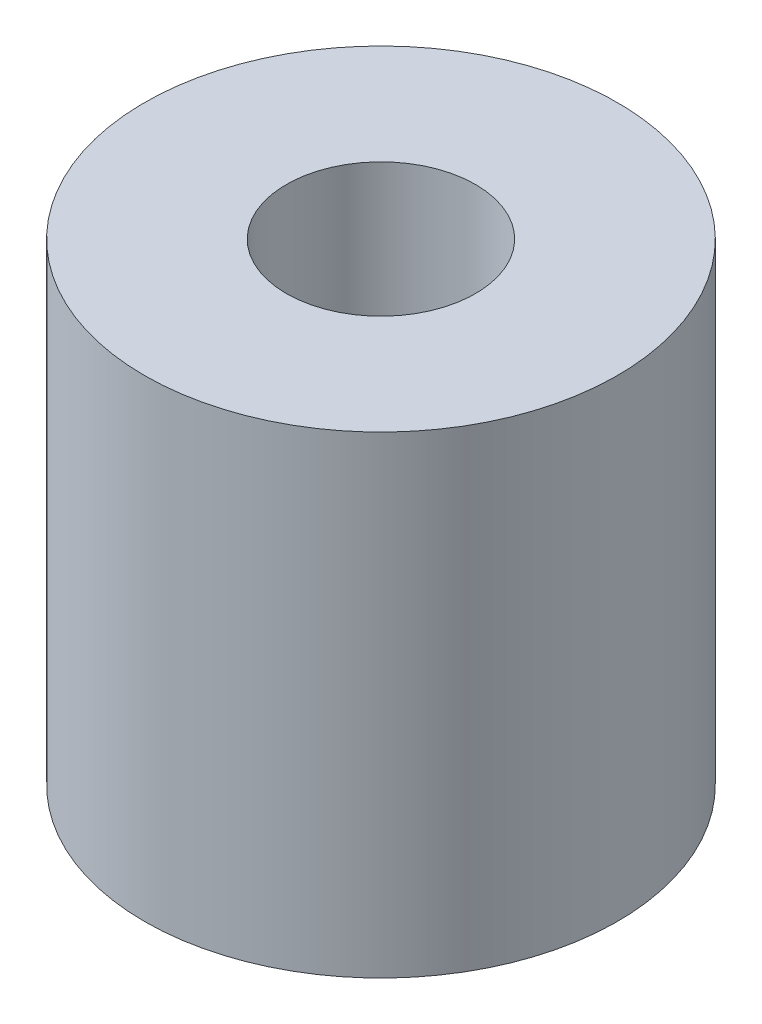
ISO-10303-21;
HEADER;
FILE_DESCRIPTION(('STEP AP214'),'2;1');
FILE_NAME('part.step','',(''),(''),'','','');
FILE_SCHEMA(('AUTOMOTIVE_DESIGN { 1 0 10303 214 1 1 1 1 }'));
ENDSEC;
DATA;
#1=APPLICATION_CONTEXT('core data for automotive mechanical design processes');
#2=APPLICATION_PROTOCOL_DEFINITION('international standard','automotive_design',2000,#1);
#3=PRODUCT_CONTEXT('',#1,'mechanical');
#4=PRODUCT('Part','Part','',(#3));
#5=PRODUCT_RELATED_PRODUCT_CATEGORY('part','',(#4));
#6=PRODUCT_DEFINITION_FORMATION('','',#4);
#7=PRODUCT_DEFINITION_CONTEXT('part definition',#1,'design');
#8=PRODUCT_DEFINITION('design','',#6,#7);
#9=PRODUCT_DEFINITION_SHAPE('','',#8);
#10=(LENGTH_UNIT() NAMED_UNIT(*) SI_UNIT(.MILLI.,.METRE.));
#11=(NAMED_UNIT(*) PLANE_ANGLE_UNIT() SI_UNIT($,.RADIAN.));
#12=(NAMED_UNIT(*) SI_UNIT($,.STERADIAN.) SOLID_ANGLE_UNIT());
#13=UNCERTAINTY_MEASURE_WITH_UNIT(LENGTH_MEASURE(1.E-05),#10,'distance_accuracy_value','');
#14=(GEOMETRIC_REPRESENTATION_CONTEXT(3) GLOBAL_UNCERTAINTY_ASSIGNED_CONTEXT((#13)) GLOBAL_UNIT_ASSIGNED_CONTEXT((#10,
#11,#12)) REPRESENTATION_CONTEXT('',''));
#15=CARTESIAN_POINT('',(0.,0.,0.));
#16=DIRECTION('',(0.,0.,1.));
#17=DIRECTION('',(1.,0.,0.));
#18=AXIS2_PLACEMENT_3D('',#15,#16,#17);
#19=CARTESIAN_POINT('',(0.,5.,0.));
#20=DIRECTION('',(0.,1.,0.));
#21=DIRECTION('',(0.,0.,1.));
#22=AXIS2_PLACEMENT_3D('',#19,#20,#21);
#23=PLANE('',#22);
#24=CARTESIAN_POINT('',(0.,5.,0.));
#25=DIRECTION('',(0.,1.,0.));
#26=DIRECTION('',(0.,0.,1.));
#27=AXIS2_PLACEMENT_3D('',#24,#25,#26);
#28=CIRCLE('',#27,2.5);
#29=CARTESIAN_POINT('',(0.,5.,2.5));
#30=VERTEX_POINT('',#29);
#31=EDGE_CURVE('E10',#30,#30,#28,.T.);
#32=ORIENTED_EDGE('',*,*,#31,.T.);
#33=EDGE_LOOP('',(#32));
#34=FACE_BOUND('',#33,.T.);
#35=CARTESIAN_POINT('',(0.,5.,0.));
#36=DIRECTION('',(0.,1.,0.));
#37=DIRECTION('',(0.,0.,1.));
#38=AXIS2_PLACEMENT_3D('',#35,#36,#37);
#39=CIRCLE('',#38,1.);
#40=CARTESIAN_POINT('',(0.,5.,1.));
#41=VERTEX_POINT('',#40);
#42=EDGE_CURVE('E47',#41,#41,#39,.T.);
#43=ORIENTED_EDGE('',*,*,#42,.F.);
#44=EDGE_LOOP('',(#43));
#45=FACE_BOUND('',#44,.T.);
#46=ADVANCED_FACE('F36',(#34,#45),#23,.T.);
#47=CARTESIAN_POINT('',(0.,0.,0.));
#48=DIRECTION('',(0.,1.,0.));
#49=DIRECTION('',(0.,0.,1.));
#50=AXIS2_PLACEMENT_3D('',#47,#48,#49);
#51=PLANE('',#50);
#52=CARTESIAN_POINT('',(0.,0.,0.));
#53=DIRECTION('',(0.,1.,0.));
#54=DIRECTION('',(0.,0.,1.));
#55=AXIS2_PLACEMENT_3D('',#52,#53,#54);
#56=CIRCLE('',#55,2.5);
#57=CARTESIAN_POINT('',(0.,0.,2.5));
#58=VERTEX_POINT('',#57);
#59=EDGE_CURVE('E40',#58,#58,#56,.T.);
#60=ORIENTED_EDGE('',*,*,#59,.F.);
#61=EDGE_LOOP('',(#60));
#62=FACE_BOUND('',#61,.T.);
#63=CARTESIAN_POINT('',(0.,0.,0.));
#64=DIRECTION('',(0.,1.,0.));
#65=DIRECTION('',(0.,0.,1.));
#66=AXIS2_PLACEMENT_3D('',#63,#64,#65);
#67=CIRCLE('',#66,1.);
#68=CARTESIAN_POINT('',(0.,0.,1.));
#69=VERTEX_POINT('',#68);
#70=EDGE_CURVE('E49',#69,#69,#67,.T.);
#71=ORIENTED_EDGE('',*,*,#70,.T.);
#72=EDGE_LOOP('',(#71));
#73=FACE_BOUND('',#72,.T.);
#74=ADVANCED_FACE('F59',(#62,#73),#51,.F.);
#75=CARTESIAN_POINT('',(0.,5.,0.));
#76=DIRECTION('',(0.,-1.,0.));
#77=DIRECTION('',(0.,0.,-1.));
#78=AXIS2_PLACEMENT_3D('',#75,#76,#77);
#79=CYLINDRICAL_SURFACE('',#78,2.5);
#80=ORIENTED_EDGE('',*,*,#31,.F.);
#81=EDGE_LOOP('',(#80));
#82=FACE_BOUND('',#81,.T.);
#83=ORIENTED_EDGE('',*,*,#59,.T.);
#84=EDGE_LOOP('',(#83));
#85=FACE_BOUND('',#84,.T.);
#86=ADVANCED_FACE('F38',(#82,#85),#79,.T.);
#87=CARTESIAN_POINT('',(0.,5.,0.));
#88=DIRECTION('',(0.,-1.,0.));
#89=DIRECTION('',(0.,0.,-1.));
#90=AXIS2_PLACEMENT_3D('',#87,#88,#89);
#91=CYLINDRICAL_SURFACE('',#90,1.);
#92=ORIENTED_EDGE('',*,*,#42,.T.);
#93=EDGE_LOOP('',(#92));
#94=FACE_BOUND('',#93,.T.);
#95=ORIENTED_EDGE('',*,*,#70,.F.);
#96=EDGE_LOOP('',(#95));
#97=FACE_BOUND('',#96,.T.);
#98=ADVANCED_FACE('F55',(#94,#97),#91,.F.);
#99=CLOSED_SHELL('',(#46,#74,#86,#98));
#100=MANIFOLD_SOLID_BREP('B2',#99);
#101=ADVANCED_BREP_SHAPE_REPRESENTATION('',(#18,#100),#14);
#102=SHAPE_DEFINITION_REPRESENTATION(#9,#101);
ENDSEC;
END-ISO-10303-21;
